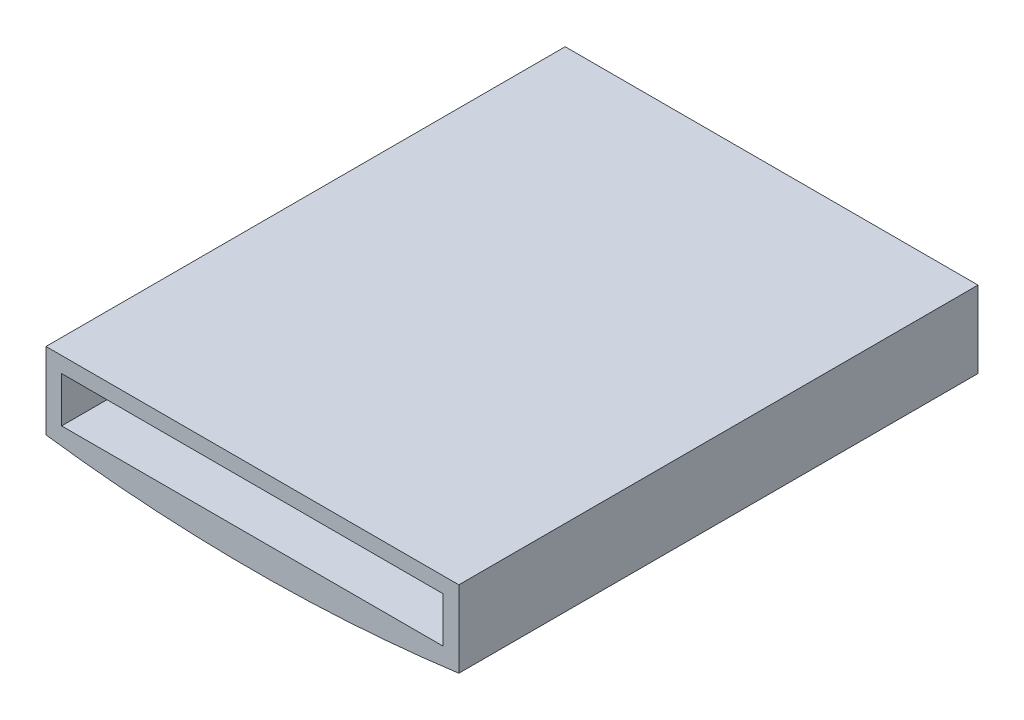
ISO-10303-21;
HEADER;
FILE_DESCRIPTION(('STEP AP214'),'2;1');
FILE_NAME('part.step','',(''),(''),'','','');
FILE_SCHEMA(('AUTOMOTIVE_DESIGN { 1 0 10303 214 1 1 1 1 }'));
ENDSEC;
DATA;
#1=APPLICATION_CONTEXT('core data for automotive mechanical design processes');
#2=APPLICATION_PROTOCOL_DEFINITION('international standard','automotive_design',2000,#1);
#3=PRODUCT_CONTEXT('',#1,'mechanical');
#4=PRODUCT('Part','Part','',(#3));
#5=PRODUCT_RELATED_PRODUCT_CATEGORY('part','',(#4));
#6=PRODUCT_DEFINITION_FORMATION('','',#4);
#7=PRODUCT_DEFINITION_CONTEXT('part definition',#1,'design');
#8=PRODUCT_DEFINITION('design','',#6,#7);
#9=PRODUCT_DEFINITION_SHAPE('','',#8);
#10=(LENGTH_UNIT() NAMED_UNIT(*) SI_UNIT(.MILLI.,.METRE.));
#11=(NAMED_UNIT(*) PLANE_ANGLE_UNIT() SI_UNIT($,.RADIAN.));
#12=(NAMED_UNIT(*) SI_UNIT($,.STERADIAN.) SOLID_ANGLE_UNIT());
#13=UNCERTAINTY_MEASURE_WITH_UNIT(LENGTH_MEASURE(1.E-05),#10,'distance_accuracy_value','');
#14=(GEOMETRIC_REPRESENTATION_CONTEXT(3) GLOBAL_UNCERTAINTY_ASSIGNED_CONTEXT((#13)) GLOBAL_UNIT_ASSIGNED_CONTEXT((#10,
#11,#12)) REPRESENTATION_CONTEXT('',''));
#15=CARTESIAN_POINT('',(0.,0.,0.));
#16=DIRECTION('',(0.,0.,1.));
#17=DIRECTION('',(1.,0.,0.));
#18=AXIS2_PLACEMENT_3D('',#15,#16,#17);
#19=CARTESIAN_POINT('',(132.,990.619195566589,166.));
#20=DIRECTION('',(0.,0.,-1.));
#21=DIRECTION('',(-1.,0.,0.));
#22=AXIS2_PLACEMENT_3D('',#19,#20,#21);
#23=CYLINDRICAL_SURFACE('',#22,999.374999999998);
#24=CARTESIAN_POINT('',(132.,990.619195566589,-151.));
#25=DIRECTION('',(0.,0.,1.));
#26=DIRECTION('',(1.,0.,0.));
#27=AXIS2_PLACEMENT_3D('',#24,#25,#26);
#28=CIRCLE('',#27,999.374999999998);
#29=CARTESIAN_POINT('',(0.,0.,-151.));
#30=VERTEX_POINT('',#29);
#31=CARTESIAN_POINT('',(264.,0.,-151.));
#32=VERTEX_POINT('',#31);
#33=EDGE_CURVE('E130',#30,#32,#28,.T.);
#34=ORIENTED_EDGE('',*,*,#33,.F.);
#35=DIRECTION('',(0.,0.,-1.));
#36=VECTOR('',#35,1.);
#37=CARTESIAN_POINT('',(0.,0.,166.));
#38=LINE('',#37,#36);
#39=CARTESIAN_POINT('',(0.,0.,-166.));
#40=VERTEX_POINT('',#39);
#41=EDGE_CURVE('E203',#30,#40,#38,.T.);
#42=ORIENTED_EDGE('',*,*,#41,.T.);
#43=CARTESIAN_POINT('',(132.,990.619195566589,-166.));
#44=DIRECTION('',(0.,0.,1.));
#45=DIRECTION('',(1.,0.,0.));
#46=AXIS2_PLACEMENT_3D('',#43,#44,#45);
#47=CIRCLE('',#46,999.374999999998);
#48=CARTESIAN_POINT('',(264.,0.,-166.));
#49=VERTEX_POINT('',#48);
#50=EDGE_CURVE('E190',#40,#49,#47,.T.);
#51=ORIENTED_EDGE('',*,*,#50,.T.);
#52=DIRECTION('',(0.,0.,-1.));
#53=VECTOR('',#52,1.);
#54=CARTESIAN_POINT('',(264.,0.,166.));
#55=LINE('',#54,#53);
#56=EDGE_CURVE('E48',#32,#49,#55,.T.);
#57=ORIENTED_EDGE('',*,*,#56,.F.);
#58=EDGE_LOOP('',(#34,#42,#51,#57));
#59=FACE_BOUND('',#58,.T.);
#60=ADVANCED_FACE('F39',(#59),#23,.T.);
#61=CARTESIAN_POINT('',(264.,0.,166.));
#62=DIRECTION('',(-1.,0.,0.));
#63=DIRECTION('',(0.,0.,1.));
#64=AXIS2_PLACEMENT_3D('',#61,#62,#63);
#65=PLANE('',#64);
#66=DIRECTION('',(0.,0.,1.));
#67=VECTOR('',#66,1.);
#68=CARTESIAN_POINT('',(264.,0.,151.));
#69=LINE('',#68,#67);
#70=CARTESIAN_POINT('',(264.,0.,151.));
#71=VERTEX_POINT('',#70);
#72=EDGE_CURVE('E122',#32,#71,#69,.T.);
#73=ORIENTED_EDGE('',*,*,#72,.F.);
#74=ORIENTED_EDGE('',*,*,#56,.T.);
#75=DIRECTION('',(0.,1.,0.));
#76=VECTOR('',#75,1.);
#77=CARTESIAN_POINT('',(264.,0.,-166.));
#78=LINE('',#77,#76);
#79=CARTESIAN_POINT('',(264.,49.,-166.));
#80=VERTEX_POINT('',#79);
#81=EDGE_CURVE('E207',#49,#80,#78,.T.);
#82=ORIENTED_EDGE('',*,*,#81,.T.);
#83=DIRECTION('',(0.,0.,-1.));
#84=VECTOR('',#83,1.);
#85=CARTESIAN_POINT('',(264.,49.,166.));
#86=LINE('',#85,#84);
#87=CARTESIAN_POINT('',(264.,49.,166.));
#88=VERTEX_POINT('',#87);
#89=EDGE_CURVE('E221',#88,#80,#86,.T.);
#90=ORIENTED_EDGE('',*,*,#89,.F.);
#91=DIRECTION('',(0.,1.,0.));
#92=VECTOR('',#91,1.);
#93=CARTESIAN_POINT('',(264.,0.,166.));
#94=LINE('',#93,#92);
#95=CARTESIAN_POINT('',(264.,0.,166.));
#96=VERTEX_POINT('',#95);
#97=EDGE_CURVE('E136',#96,#88,#94,.T.);
#98=ORIENTED_EDGE('',*,*,#97,.F.);
#99=EDGE_CURVE('E11',#96,#71,#55,.T.);
#100=ORIENTED_EDGE('',*,*,#99,.T.);
#101=EDGE_LOOP('',(#73,#74,#82,#90,#98,#100));
#102=FACE_BOUND('',#101,.T.);
#103=ADVANCED_FACE('F134',(#102),#65,.F.);
#104=CARTESIAN_POINT('',(0.,0.,166.));
#105=DIRECTION('',(1.,0.,0.));
#106=DIRECTION('',(0.,0.,-1.));
#107=AXIS2_PLACEMENT_3D('',#104,#105,#106);
#108=PLANE('',#107);
#109=ORIENTED_EDGE('',*,*,#41,.F.);
#110=DIRECTION('',(0.,0.,-1.));
#111=VECTOR('',#110,1.);
#112=CARTESIAN_POINT('',(0.,0.,151.));
#113=LINE('',#112,#111);
#114=CARTESIAN_POINT('',(0.,0.,151.));
#115=VERTEX_POINT('',#114);
#116=EDGE_CURVE('E144',#115,#30,#113,.T.);
#117=ORIENTED_EDGE('',*,*,#116,.F.);
#118=CARTESIAN_POINT('',(0.,0.,166.));
#119=VERTEX_POINT('',#118);
#120=EDGE_CURVE('E128',#119,#115,#38,.T.);
#121=ORIENTED_EDGE('',*,*,#120,.F.);
#122=DIRECTION('',(0.,-1.,0.));
#123=VECTOR('',#122,1.);
#124=CARTESIAN_POINT('',(0.,0.,166.));
#125=LINE('',#124,#123);
#126=CARTESIAN_POINT('',(0.,49.,166.));
#127=VERTEX_POINT('',#126);
#128=EDGE_CURVE('E200',#127,#119,#125,.T.);
#129=ORIENTED_EDGE('',*,*,#128,.F.);
#130=DIRECTION('',(0.,0.,-1.));
#131=VECTOR('',#130,1.);
#132=CARTESIAN_POINT('',(0.,49.,166.));
#133=LINE('',#132,#131);
#134=CARTESIAN_POINT('',(0.,49.,-166.));
#135=VERTEX_POINT('',#134);
#136=EDGE_CURVE('E218',#127,#135,#133,.T.);
#137=ORIENTED_EDGE('',*,*,#136,.T.);
#138=DIRECTION('',(0.,-1.,0.));
#139=VECTOR('',#138,1.);
#140=CARTESIAN_POINT('',(0.,0.,-166.));
#141=LINE('',#140,#139);
#142=EDGE_CURVE('E194',#135,#40,#141,.T.);
#143=ORIENTED_EDGE('',*,*,#142,.T.);
#144=EDGE_LOOP('',(#109,#117,#121,#129,#137,#143));
#145=FACE_BOUND('',#144,.T.);
#146=ADVANCED_FACE('F240',(#145),#108,.F.);
#147=CARTESIAN_POINT('',(132.,990.619195566589,166.));
#148=DIRECTION('',(0.,0.,1.));
#149=DIRECTION('',(1.,0.,0.));
#150=AXIS2_PLACEMENT_3D('',#147,#148,#149);
#151=PLANE('',#150);
#152=CARTESIAN_POINT('',(132.,990.619195566589,166.));
#153=DIRECTION('',(0.,0.,1.));
#154=DIRECTION('',(1.,0.,0.));
#155=AXIS2_PLACEMENT_3D('',#152,#153,#154);
#156=CIRCLE('',#155,999.374999999998);
#157=EDGE_CURVE('E191',#119,#96,#156,.T.);
#158=ORIENTED_EDGE('',*,*,#157,.T.);
#159=ORIENTED_EDGE('',*,*,#97,.T.);
#160=DIRECTION('',(-1.,0.,0.));
#161=VECTOR('',#160,1.);
#162=CARTESIAN_POINT('',(0.,49.,166.));
#163=LINE('',#162,#161);
#164=EDGE_CURVE('E197',#88,#127,#163,.T.);
#165=ORIENTED_EDGE('',*,*,#164,.T.);
#166=ORIENTED_EDGE('',*,*,#128,.T.);
#167=EDGE_LOOP('',(#158,#159,#165,#166));
#168=FACE_BOUND('',#167,.T.);
#169=DIRECTION('',(1.,0.,0.));
#170=VECTOR('',#169,1.);
#171=CARTESIAN_POINT('',(10.,10.,166.));
#172=LINE('',#171,#170);
#173=CARTESIAN_POINT('',(10.,10.,166.));
#174=VERTEX_POINT('',#173);
#175=CARTESIAN_POINT('',(254.,10.,166.));
#176=VERTEX_POINT('',#175);
#177=EDGE_CURVE('E154',#174,#176,#172,.T.);
#178=ORIENTED_EDGE('',*,*,#177,.F.);
#179=DIRECTION('',(0.,-1.,0.));
#180=VECTOR('',#179,1.);
#181=CARTESIAN_POINT('',(10.,39.,166.));
#182=LINE('',#181,#180);
#183=CARTESIAN_POINT('',(10.,39.,166.));
#184=VERTEX_POINT('',#183);
#185=EDGE_CURVE('E151',#184,#174,#182,.T.);
#186=ORIENTED_EDGE('',*,*,#185,.F.);
#187=DIRECTION('',(-1.,0.,0.));
#188=VECTOR('',#187,1.);
#189=CARTESIAN_POINT('',(10.,39.,166.));
#190=LINE('',#189,#188);
#191=CARTESIAN_POINT('',(254.,39.,166.));
#192=VERTEX_POINT('',#191);
#193=EDGE_CURVE('E161',#192,#184,#190,.T.);
#194=ORIENTED_EDGE('',*,*,#193,.F.);
#195=DIRECTION('',(0.,1.,0.));
#196=VECTOR('',#195,1.);
#197=CARTESIAN_POINT('',(254.,39.,166.));
#198=LINE('',#197,#196);
#199=EDGE_CURVE('E158',#176,#192,#198,.T.);
#200=ORIENTED_EDGE('',*,*,#199,.F.);
#201=EDGE_LOOP('',(#178,#186,#194,#200));
#202=FACE_BOUND('',#201,.T.);
#203=ADVANCED_FACE('F245',(#168,#202),#151,.T.);
#204=CARTESIAN_POINT('',(132.,990.619195566589,-166.));
#205=DIRECTION('',(0.,0.,1.));
#206=DIRECTION('',(1.,0.,0.));
#207=AXIS2_PLACEMENT_3D('',#204,#205,#206);
#208=PLANE('',#207);
#209=ORIENTED_EDGE('',*,*,#50,.F.);
#210=ORIENTED_EDGE('',*,*,#142,.F.);
#211=DIRECTION('',(-1.,0.,0.));
#212=VECTOR('',#211,1.);
#213=CARTESIAN_POINT('',(0.,49.,-166.));
#214=LINE('',#213,#212);
#215=EDGE_CURVE('E210',#80,#135,#214,.T.);
#216=ORIENTED_EDGE('',*,*,#215,.F.);
#217=ORIENTED_EDGE('',*,*,#81,.F.);
#218=EDGE_LOOP('',(#209,#210,#216,#217));
#219=FACE_BOUND('',#218,.T.);
#220=DIRECTION('',(0.,-1.,0.));
#221=VECTOR('',#220,1.);
#222=CARTESIAN_POINT('',(10.,39.,-166.));
#223=LINE('',#222,#221);
#224=CARTESIAN_POINT('',(10.,39.,-166.));
#225=VERTEX_POINT('',#224);
#226=CARTESIAN_POINT('',(10.,10.,-166.));
#227=VERTEX_POINT('',#226);
#228=EDGE_CURVE('E150',#225,#227,#223,.T.);
#229=ORIENTED_EDGE('',*,*,#228,.T.);
#230=DIRECTION('',(1.,0.,0.));
#231=VECTOR('',#230,1.);
#232=CARTESIAN_POINT('',(10.,10.,-166.));
#233=LINE('',#232,#231);
#234=CARTESIAN_POINT('',(254.,10.,-166.));
#235=VERTEX_POINT('',#234);
#236=EDGE_CURVE('E168',#227,#235,#233,.T.);
#237=ORIENTED_EDGE('',*,*,#236,.T.);
#238=DIRECTION('',(0.,1.,0.));
#239=VECTOR('',#238,1.);
#240=CARTESIAN_POINT('',(254.,39.,-166.));
#241=LINE('',#240,#239);
#242=CARTESIAN_POINT('',(254.,39.,-166.));
#243=VERTEX_POINT('',#242);
#244=EDGE_CURVE('E172',#235,#243,#241,.T.);
#245=ORIENTED_EDGE('',*,*,#244,.T.);
#246=DIRECTION('',(-1.,0.,0.));
#247=VECTOR('',#246,1.);
#248=CARTESIAN_POINT('',(10.,39.,-166.));
#249=LINE('',#248,#247);
#250=EDGE_CURVE('E155',#243,#225,#249,.T.);
#251=ORIENTED_EDGE('',*,*,#250,.T.);
#252=EDGE_LOOP('',(#229,#237,#245,#251));
#253=FACE_BOUND('',#252,.T.);
#254=ADVANCED_FACE('F234',(#219,#253),#208,.F.);
#255=ORIENTED_EDGE('',*,*,#120,.T.);
#256=CARTESIAN_POINT('',(132.,990.619195566589,151.));
#257=DIRECTION('',(0.,0.,1.));
#258=DIRECTION('',(1.,0.,0.));
#259=AXIS2_PLACEMENT_3D('',#256,#257,#258);
#260=CIRCLE('',#259,999.374999999998);
#261=EDGE_CURVE('E54',#115,#71,#260,.T.);
#262=ORIENTED_EDGE('',*,*,#261,.T.);
#263=ORIENTED_EDGE('',*,*,#99,.F.);
#264=ORIENTED_EDGE('',*,*,#157,.F.);
#265=EDGE_LOOP('',(#255,#262,#263,#264));
#266=FACE_BOUND('',#265,.T.);
#267=ADVANCED_FACE('F41',(#266),#23,.T.);
#268=CARTESIAN_POINT('',(0.,49.,166.));
#269=DIRECTION('',(0.,-1.,0.));
#270=DIRECTION('',(0.,0.,-1.));
#271=AXIS2_PLACEMENT_3D('',#268,#269,#270);
#272=PLANE('',#271);
#273=ORIENTED_EDGE('',*,*,#215,.T.);
#274=ORIENTED_EDGE('',*,*,#136,.F.);
#275=ORIENTED_EDGE('',*,*,#164,.F.);
#276=ORIENTED_EDGE('',*,*,#89,.T.);
#277=EDGE_LOOP('',(#273,#274,#275,#276));
#278=FACE_BOUND('',#277,.T.);
#279=ADVANCED_FACE('F243',(#278),#272,.F.);
#280=CARTESIAN_POINT('',(10.,39.,166.));
#281=DIRECTION('',(1.,0.,0.));
#282=DIRECTION('',(0.,1.,0.));
#283=AXIS2_PLACEMENT_3D('',#280,#281,#282);
#284=PLANE('',#283);
#285=ORIENTED_EDGE('',*,*,#228,.F.);
#286=DIRECTION('',(0.,0.,-1.));
#287=VECTOR('',#286,1.);
#288=CARTESIAN_POINT('',(10.,39.,166.));
#289=LINE('',#288,#287);
#290=EDGE_CURVE('E164',#184,#225,#289,.T.);
#291=ORIENTED_EDGE('',*,*,#290,.F.);
#292=ORIENTED_EDGE('',*,*,#185,.T.);
#293=DIRECTION('',(0.,0.,-1.));
#294=VECTOR('',#293,1.);
#295=CARTESIAN_POINT('',(10.,10.,166.));
#296=LINE('',#295,#294);
#297=EDGE_CURVE('E187',#174,#227,#296,.T.);
#298=ORIENTED_EDGE('',*,*,#297,.T.);
#299=EDGE_LOOP('',(#285,#291,#292,#298));
#300=FACE_BOUND('',#299,.T.);
#301=ADVANCED_FACE('F264',(#300),#284,.T.);
#302=CARTESIAN_POINT('',(10.,10.,166.));
#303=DIRECTION('',(0.,1.,0.));
#304=DIRECTION('',(0.,0.,1.));
#305=AXIS2_PLACEMENT_3D('',#302,#303,#304);
#306=PLANE('',#305);
#307=DIRECTION('',(0.,0.,-1.));
#308=VECTOR('',#307,1.);
#309=CARTESIAN_POINT('',(254.,10.,166.));
#310=LINE('',#309,#308);
#311=EDGE_CURVE('E184',#176,#235,#310,.T.);
#312=ORIENTED_EDGE('',*,*,#311,.T.);
#313=ORIENTED_EDGE('',*,*,#236,.F.);
#314=ORIENTED_EDGE('',*,*,#297,.F.);
#315=ORIENTED_EDGE('',*,*,#177,.T.);
#316=EDGE_LOOP('',(#312,#313,#314,#315));
#317=FACE_BOUND('',#316,.T.);
#318=ADVANCED_FACE('F257',(#317),#306,.T.);
#319=CARTESIAN_POINT('',(254.,39.,166.));
#320=DIRECTION('',(-1.,0.,0.));
#321=DIRECTION('',(0.,0.,1.));
#322=AXIS2_PLACEMENT_3D('',#319,#320,#321);
#323=PLANE('',#322);
#324=ORIENTED_EDGE('',*,*,#244,.F.);
#325=ORIENTED_EDGE('',*,*,#311,.F.);
#326=ORIENTED_EDGE('',*,*,#199,.T.);
#327=DIRECTION('',(0.,0.,-1.));
#328=VECTOR('',#327,1.);
#329=CARTESIAN_POINT('',(254.,39.,166.));
#330=LINE('',#329,#328);
#331=EDGE_CURVE('E62',#192,#243,#330,.T.);
#332=ORIENTED_EDGE('',*,*,#331,.T.);
#333=EDGE_LOOP('',(#324,#325,#326,#332));
#334=FACE_BOUND('',#333,.T.);
#335=ADVANCED_FACE('F261',(#334),#323,.T.);
#336=CARTESIAN_POINT('',(10.,39.,166.));
#337=DIRECTION('',(0.,-1.,0.));
#338=DIRECTION('',(0.,0.,-1.));
#339=AXIS2_PLACEMENT_3D('',#336,#337,#338);
#340=PLANE('',#339);
#341=ORIENTED_EDGE('',*,*,#250,.F.);
#342=ORIENTED_EDGE('',*,*,#331,.F.);
#343=ORIENTED_EDGE('',*,*,#193,.T.);
#344=ORIENTED_EDGE('',*,*,#290,.T.);
#345=EDGE_LOOP('',(#341,#342,#343,#344));
#346=FACE_BOUND('',#345,.T.);
#347=ADVANCED_FACE('F265',(#346),#340,.T.);
#348=CARTESIAN_POINT('',(0.,0.,-151.));
#349=DIRECTION('',(0.,0.,1.));
#350=DIRECTION('',(1.,0.,0.));
#351=AXIS2_PLACEMENT_3D('',#348,#349,#350);
#352=PLANE('',#351);
#353=DIRECTION('',(1.,0.,0.));
#354=VECTOR('',#353,1.);
#355=CARTESIAN_POINT('',(0.,0.,-151.));
#356=LINE('',#355,#354);
#357=EDGE_CURVE('E140',#30,#32,#356,.T.);
#358=ORIENTED_EDGE('',*,*,#357,.F.);
#359=ORIENTED_EDGE('',*,*,#33,.T.);
#360=EDGE_LOOP('',(#358,#359));
#361=FACE_BOUND('',#360,.T.);
#362=ADVANCED_FACE('F267',(#361),#352,.T.);
#363=CARTESIAN_POINT('',(0.,0.,151.));
#364=DIRECTION('',(0.,0.,1.));
#365=DIRECTION('',(1.,0.,0.));
#366=AXIS2_PLACEMENT_3D('',#363,#364,#365);
#367=PLANE('',#366);
#368=ORIENTED_EDGE('',*,*,#261,.F.);
#369=DIRECTION('',(-1.,0.,0.));
#370=VECTOR('',#369,1.);
#371=CARTESIAN_POINT('',(0.,0.,151.));
#372=LINE('',#371,#370);
#373=EDGE_CURVE('E115',#71,#115,#372,.T.);
#374=ORIENTED_EDGE('',*,*,#373,.F.);
#375=EDGE_LOOP('',(#368,#374));
#376=FACE_BOUND('',#375,.T.);
#377=ADVANCED_FACE('F116',(#376),#367,.F.);
#378=CARTESIAN_POINT('',(0.,0.,0.));
#379=DIRECTION('',(0.,-1.,0.));
#380=DIRECTION('',(0.,0.,-1.));
#381=AXIS2_PLACEMENT_3D('',#378,#379,#380);
#382=PLANE('',#381);
#383=ORIENTED_EDGE('',*,*,#116,.T.);
#384=ORIENTED_EDGE('',*,*,#357,.T.);
#385=ORIENTED_EDGE('',*,*,#72,.T.);
#386=ORIENTED_EDGE('',*,*,#373,.T.);
#387=EDGE_LOOP('',(#383,#384,#385,#386));
#388=FACE_BOUND('',#387,.T.);
#389=ADVANCED_FACE('F139',(#388),#382,.T.);
#390=CLOSED_SHELL('',(#60,#103,#146,#203,#254,#267,#279,#301,#318,#335,#347,#362,#377,#389));
#391=MANIFOLD_SOLID_BREP('B2',#390);
#392=ADVANCED_BREP_SHAPE_REPRESENTATION('',(#18,#391),#14);
#393=SHAPE_DEFINITION_REPRESENTATION(#9,#392);
ENDSEC;
END-ISO-10303-21;
